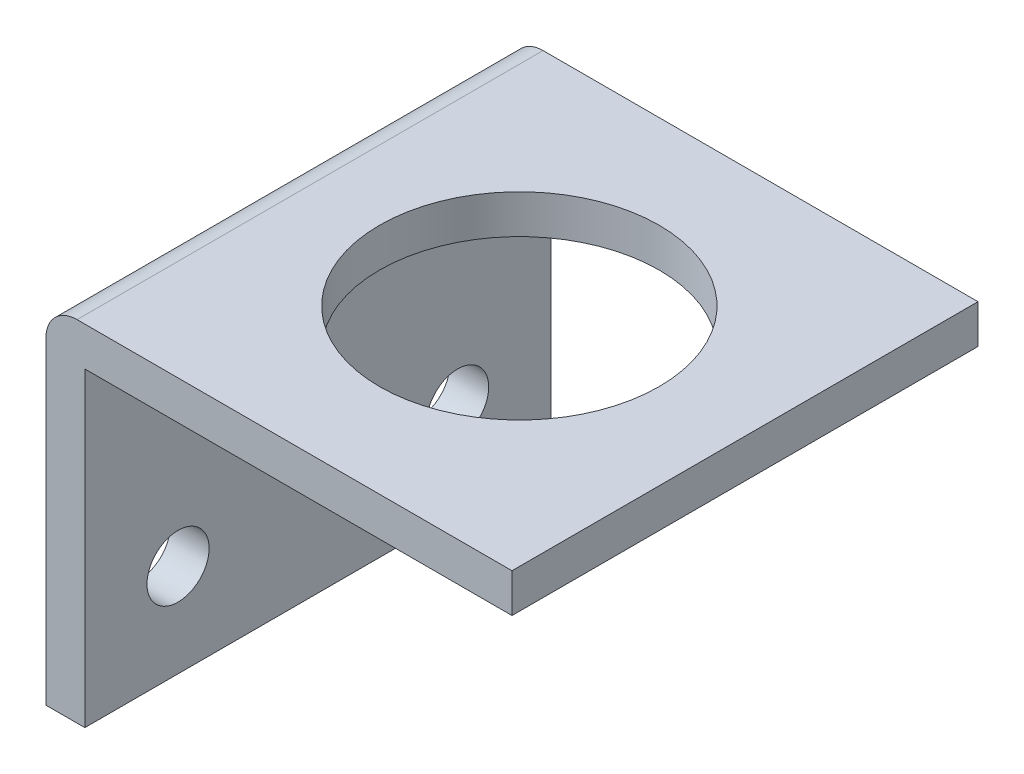
ISO-10303-21;
HEADER;
FILE_DESCRIPTION(('STEP AP214'),'2;1');
FILE_NAME('part.step','',(''),(''),'','','');
FILE_SCHEMA(('AUTOMOTIVE_DESIGN { 1 0 10303 214 1 1 1 1 }'));
ENDSEC;
DATA;
#1=APPLICATION_CONTEXT('core data for automotive mechanical design processes');
#2=APPLICATION_PROTOCOL_DEFINITION('international standard','automotive_design',2000,#1);
#3=PRODUCT_CONTEXT('',#1,'mechanical');
#4=PRODUCT('Part','Part','',(#3));
#5=PRODUCT_RELATED_PRODUCT_CATEGORY('part','',(#4));
#6=PRODUCT_DEFINITION_FORMATION('','',#4);
#7=PRODUCT_DEFINITION_CONTEXT('part definition',#1,'design');
#8=PRODUCT_DEFINITION('design','',#6,#7);
#9=PRODUCT_DEFINITION_SHAPE('','',#8);
#10=(LENGTH_UNIT() NAMED_UNIT(*) SI_UNIT(.MILLI.,.METRE.));
#11=(NAMED_UNIT(*) PLANE_ANGLE_UNIT() SI_UNIT($,.RADIAN.));
#12=(NAMED_UNIT(*) SI_UNIT($,.STERADIAN.) SOLID_ANGLE_UNIT());
#13=UNCERTAINTY_MEASURE_WITH_UNIT(LENGTH_MEASURE(1.E-05),#10,'distance_accuracy_value','');
#14=(GEOMETRIC_REPRESENTATION_CONTEXT(3) GLOBAL_UNCERTAINTY_ASSIGNED_CONTEXT((#13)) GLOBAL_UNIT_ASSIGNED_CONTEXT((#10,
#11,#12)) REPRESENTATION_CONTEXT('',''));
#15=CARTESIAN_POINT('',(0.,0.,0.));
#16=DIRECTION('',(0.,0.,1.));
#17=DIRECTION('',(1.,0.,0.));
#18=AXIS2_PLACEMENT_3D('',#15,#16,#17);
#19=CARTESIAN_POINT('',(0.,25.4,38.1));
#20=DIRECTION('',(0.,1.,0.));
#21=DIRECTION('',(0.,0.,1.));
#22=AXIS2_PLACEMENT_3D('',#19,#20,#21);
#23=PLANE('',#22);
#24=CARTESIAN_POINT('',(19.6498845337629,25.4,19.05));
#25=DIRECTION('',(0.,1.,0.));
#26=DIRECTION('',(0.,0.,1.));
#27=AXIS2_PLACEMENT_3D('',#24,#25,#26);
#28=CIRCLE('',#27,11.43);
#29=CARTESIAN_POINT('',(19.6498845337629,25.4,30.48));
#30=VERTEX_POINT('',#29);
#31=EDGE_CURVE('E164',#30,#30,#28,.T.);
#32=ORIENTED_EDGE('',*,*,#31,.T.);
#33=EDGE_LOOP('',(#32));
#34=FACE_BOUND('',#33,.T.);
#35=DIRECTION('',(1.,0.,0.));
#36=VECTOR('',#35,1.);
#37=CARTESIAN_POINT('',(0.,25.4,0.));
#38=LINE('',#37,#36);
#39=CARTESIAN_POINT('',(3.17499999999999,25.4,0.));
#40=VERTEX_POINT('',#39);
#41=CARTESIAN_POINT('',(38.1,25.4,0.));
#42=VERTEX_POINT('',#41);
#43=EDGE_CURVE('E127',#40,#42,#38,.T.);
#44=ORIENTED_EDGE('',*,*,#43,.T.);
#45=DIRECTION('',(0.,0.,-1.));
#46=VECTOR('',#45,1.);
#47=CARTESIAN_POINT('',(38.1,25.4,38.1));
#48=LINE('',#47,#46);
#49=CARTESIAN_POINT('',(38.1,25.4,38.1));
#50=VERTEX_POINT('',#49);
#51=EDGE_CURVE('E107',#50,#42,#48,.T.);
#52=ORIENTED_EDGE('',*,*,#51,.F.);
#53=DIRECTION('',(1.,0.,0.));
#54=VECTOR('',#53,1.);
#55=CARTESIAN_POINT('',(0.,25.4,38.1));
#56=LINE('',#55,#54);
#57=CARTESIAN_POINT('',(3.17499999999999,25.4,38.1));
#58=VERTEX_POINT('',#57);
#59=EDGE_CURVE('E114',#58,#50,#56,.T.);
#60=ORIENTED_EDGE('',*,*,#59,.F.);
#61=DIRECTION('',(0.,0.,-1.));
#62=VECTOR('',#61,1.);
#63=CARTESIAN_POINT('',(3.17499999999999,25.4,38.1));
#64=LINE('',#63,#62);
#65=EDGE_CURVE('E179',#58,#40,#64,.T.);
#66=ORIENTED_EDGE('',*,*,#65,.T.);
#67=EDGE_LOOP('',(#44,#52,#60,#66));
#68=FACE_BOUND('',#67,.T.);
#69=ADVANCED_FACE('F41',(#34,#68),#23,.F.);
#70=CARTESIAN_POINT('',(38.1,0.,38.1));
#71=DIRECTION('',(-1.,0.,0.));
#72=DIRECTION('',(0.,0.,1.));
#73=AXIS2_PLACEMENT_3D('',#70,#71,#72);
#74=PLANE('',#73);
#75=DIRECTION('',(0.,1.,0.));
#76=VECTOR('',#75,1.);
#77=CARTESIAN_POINT('',(38.1,0.,0.));
#78=LINE('',#77,#76);
#79=CARTESIAN_POINT('',(38.1,28.575,0.));
#80=VERTEX_POINT('',#79);
#81=EDGE_CURVE('E182',#42,#80,#78,.T.);
#82=ORIENTED_EDGE('',*,*,#81,.T.);
#83=DIRECTION('',(0.,0.,-1.));
#84=VECTOR('',#83,1.);
#85=CARTESIAN_POINT('',(38.1,28.575,38.1));
#86=LINE('',#85,#84);
#87=CARTESIAN_POINT('',(38.1,28.575,38.1));
#88=VERTEX_POINT('',#87);
#89=EDGE_CURVE('E110',#88,#80,#86,.T.);
#90=ORIENTED_EDGE('',*,*,#89,.F.);
#91=DIRECTION('',(0.,1.,0.));
#92=VECTOR('',#91,1.);
#93=CARTESIAN_POINT('',(38.1,0.,38.1));
#94=LINE('',#93,#92);
#95=EDGE_CURVE('E102',#50,#88,#94,.T.);
#96=ORIENTED_EDGE('',*,*,#95,.F.);
#97=ORIENTED_EDGE('',*,*,#51,.T.);
#98=EDGE_LOOP('',(#82,#90,#96,#97));
#99=FACE_BOUND('',#98,.T.);
#100=ADVANCED_FACE('F105',(#99),#74,.F.);
#101=CARTESIAN_POINT('',(0.,28.575,38.1));
#102=DIRECTION('',(0.,1.,0.));
#103=DIRECTION('',(0.,0.,1.));
#104=AXIS2_PLACEMENT_3D('',#101,#102,#103);
#105=PLANE('',#104);
#106=CARTESIAN_POINT('',(19.6498845337629,28.575,19.05));
#107=DIRECTION('',(0.,1.,0.));
#108=DIRECTION('',(0.,0.,1.));
#109=AXIS2_PLACEMENT_3D('',#106,#107,#108);
#110=CIRCLE('',#109,11.43);
#111=CARTESIAN_POINT('',(19.6498845337629,28.575,30.48));
#112=VERTEX_POINT('',#111);
#113=EDGE_CURVE('E151',#112,#112,#110,.T.);
#114=ORIENTED_EDGE('',*,*,#113,.F.);
#115=EDGE_LOOP('',(#114));
#116=FACE_BOUND('',#115,.T.);
#117=DIRECTION('',(1.,0.,0.));
#118=VECTOR('',#117,1.);
#119=CARTESIAN_POINT('',(0.,28.575,0.));
#120=LINE('',#119,#118);
#121=CARTESIAN_POINT('',(2.54,28.575,0.));
#122=VERTEX_POINT('',#121);
#123=EDGE_CURVE('E185',#122,#80,#120,.T.);
#124=ORIENTED_EDGE('',*,*,#123,.F.);
#125=DIRECTION('',(0.,0.,-1.));
#126=VECTOR('',#125,1.);
#127=CARTESIAN_POINT('',(2.54,28.575,38.1));
#128=LINE('',#127,#126);
#129=CARTESIAN_POINT('',(2.54,28.575,38.1));
#130=VERTEX_POINT('',#129);
#131=EDGE_CURVE('E51',#122,#130,#128,.F.);
#132=ORIENTED_EDGE('',*,*,#131,.T.);
#133=DIRECTION('',(1.,0.,0.));
#134=VECTOR('',#133,1.);
#135=CARTESIAN_POINT('',(0.,28.575,38.1));
#136=LINE('',#135,#134);
#137=EDGE_CURVE('E113',#130,#88,#136,.T.);
#138=ORIENTED_EDGE('',*,*,#137,.T.);
#139=ORIENTED_EDGE('',*,*,#89,.T.);
#140=EDGE_LOOP('',(#124,#132,#138,#139));
#141=FACE_BOUND('',#140,.T.);
#142=ADVANCED_FACE('F216',(#116,#141),#105,.T.);
#143=CARTESIAN_POINT('',(0.,0.,38.1));
#144=DIRECTION('',(-1.,0.,0.));
#145=DIRECTION('',(0.,0.,1.));
#146=AXIS2_PLACEMENT_3D('',#143,#144,#145);
#147=PLANE('',#146);
#148=CARTESIAN_POINT('',(0.,7.62,7.62));
#149=DIRECTION('',(-1.,0.,0.));
#150=DIRECTION('',(0.,0.,1.));
#151=AXIS2_PLACEMENT_3D('',#148,#149,#150);
#152=CIRCLE('',#151,2.54);
#153=CARTESIAN_POINT('',(0.,7.62,10.16));
#154=VERTEX_POINT('',#153);
#155=EDGE_CURVE('E145',#154,#154,#152,.T.);
#156=ORIENTED_EDGE('',*,*,#155,.F.);
#157=EDGE_LOOP('',(#156));
#158=FACE_BOUND('',#157,.T.);
#159=CARTESIAN_POINT('',(0.,7.62,30.48));
#160=DIRECTION('',(-1.,0.,0.));
#161=DIRECTION('',(0.,0.,1.));
#162=AXIS2_PLACEMENT_3D('',#159,#160,#161);
#163=CIRCLE('',#162,2.54000000000001);
#164=CARTESIAN_POINT('',(0.,7.62,33.02));
#165=VERTEX_POINT('',#164);
#166=EDGE_CURVE('E153',#165,#165,#163,.T.);
#167=ORIENTED_EDGE('',*,*,#166,.F.);
#168=EDGE_LOOP('',(#167));
#169=FACE_BOUND('',#168,.T.);
#170=DIRECTION('',(0.,1.,0.));
#171=VECTOR('',#170,1.);
#172=CARTESIAN_POINT('',(0.,0.,38.1));
#173=LINE('',#172,#171);
#174=CARTESIAN_POINT('',(0.,0.,38.1));
#175=VERTEX_POINT('',#174);
#176=CARTESIAN_POINT('',(0.,26.035,38.1));
#177=VERTEX_POINT('',#176);
#178=EDGE_CURVE('E170',#175,#177,#173,.T.);
#179=ORIENTED_EDGE('',*,*,#178,.T.);
#180=DIRECTION('',(0.,0.,-1.));
#181=VECTOR('',#180,1.);
#182=CARTESIAN_POINT('',(0.,26.035,38.1));
#183=LINE('',#182,#181);
#184=CARTESIAN_POINT('',(0.,26.035,0.));
#185=VERTEX_POINT('',#184);
#186=EDGE_CURVE('E129',#177,#185,#183,.T.);
#187=ORIENTED_EDGE('',*,*,#186,.T.);
#188=DIRECTION('',(0.,1.,0.));
#189=VECTOR('',#188,1.);
#190=CARTESIAN_POINT('',(0.,0.,0.));
#191=LINE('',#190,#189);
#192=CARTESIAN_POINT('',(0.,0.,0.));
#193=VERTEX_POINT('',#192);
#194=EDGE_CURVE('E188',#193,#185,#191,.T.);
#195=ORIENTED_EDGE('',*,*,#194,.F.);
#196=DIRECTION('',(0.,0.,-1.));
#197=VECTOR('',#196,1.);
#198=CARTESIAN_POINT('',(0.,0.,38.1));
#199=LINE('',#198,#197);
#200=EDGE_CURVE('E135',#175,#193,#199,.T.);
#201=ORIENTED_EDGE('',*,*,#200,.F.);
#202=EDGE_LOOP('',(#179,#187,#195,#201));
#203=FACE_BOUND('',#202,.T.);
#204=ADVANCED_FACE('F212',(#158,#169,#203),#147,.T.);
#205=CARTESIAN_POINT('',(0.,0.,38.1));
#206=DIRECTION('',(0.,1.,0.));
#207=DIRECTION('',(0.,0.,1.));
#208=AXIS2_PLACEMENT_3D('',#205,#206,#207);
#209=PLANE('',#208);
#210=DIRECTION('',(1.,0.,0.));
#211=VECTOR('',#210,1.);
#212=CARTESIAN_POINT('',(0.,0.,0.));
#213=LINE('',#212,#211);
#214=CARTESIAN_POINT('',(3.175,0.,0.));
#215=VERTEX_POINT('',#214);
#216=EDGE_CURVE('E191',#193,#215,#213,.T.);
#217=ORIENTED_EDGE('',*,*,#216,.T.);
#218=DIRECTION('',(0.,0.,-1.));
#219=VECTOR('',#218,1.);
#220=CARTESIAN_POINT('',(3.175,0.,38.1));
#221=LINE('',#220,#219);
#222=CARTESIAN_POINT('',(3.175,0.,38.1));
#223=VERTEX_POINT('',#222);
#224=EDGE_CURVE('E198',#223,#215,#221,.T.);
#225=ORIENTED_EDGE('',*,*,#224,.F.);
#226=DIRECTION('',(1.,0.,0.));
#227=VECTOR('',#226,1.);
#228=CARTESIAN_POINT('',(0.,0.,38.1));
#229=LINE('',#228,#227);
#230=EDGE_CURVE('E174',#175,#223,#229,.T.);
#231=ORIENTED_EDGE('',*,*,#230,.F.);
#232=ORIENTED_EDGE('',*,*,#200,.T.);
#233=EDGE_LOOP('',(#217,#225,#231,#232));
#234=FACE_BOUND('',#233,.T.);
#235=ADVANCED_FACE('F205',(#234),#209,.F.);
#236=CARTESIAN_POINT('',(3.175,0.,38.1));
#237=DIRECTION('',(-1.,0.,0.));
#238=DIRECTION('',(0.,-1.,0.));
#239=AXIS2_PLACEMENT_3D('',#236,#237,#238);
#240=PLANE('',#239);
#241=CARTESIAN_POINT('',(3.175,7.62,7.62));
#242=DIRECTION('',(-1.,0.,0.));
#243=DIRECTION('',(0.,-1.,0.));
#244=AXIS2_PLACEMENT_3D('',#241,#242,#243);
#245=CIRCLE('',#244,2.54);
#246=CARTESIAN_POINT('',(3.17500000000001,7.62,10.16));
#247=VERTEX_POINT('',#246);
#248=EDGE_CURVE('E45',#247,#247,#245,.T.);
#249=ORIENTED_EDGE('',*,*,#248,.T.);
#250=EDGE_LOOP('',(#249));
#251=FACE_BOUND('',#250,.T.);
#252=CARTESIAN_POINT('',(3.175,7.62,30.48));
#253=DIRECTION('',(-1.,0.,0.));
#254=DIRECTION('',(0.,-1.,0.));
#255=AXIS2_PLACEMENT_3D('',#252,#253,#254);
#256=CIRCLE('',#255,2.54000000000001);
#257=CARTESIAN_POINT('',(3.17500000000001,7.62,33.02));
#258=VERTEX_POINT('',#257);
#259=EDGE_CURVE('E142',#258,#258,#256,.T.);
#260=ORIENTED_EDGE('',*,*,#259,.T.);
#261=EDGE_LOOP('',(#260));
#262=FACE_BOUND('',#261,.T.);
#263=DIRECTION('',(0.,1.,0.));
#264=VECTOR('',#263,1.);
#265=CARTESIAN_POINT('',(3.175,0.,0.));
#266=LINE('',#265,#264);
#267=EDGE_CURVE('E124',#215,#40,#266,.T.);
#268=ORIENTED_EDGE('',*,*,#267,.T.);
#269=ORIENTED_EDGE('',*,*,#65,.F.);
#270=DIRECTION('',(0.,1.,0.));
#271=VECTOR('',#270,1.);
#272=CARTESIAN_POINT('',(3.175,0.,38.1));
#273=LINE('',#272,#271);
#274=EDGE_CURVE('E119',#223,#58,#273,.T.);
#275=ORIENTED_EDGE('',*,*,#274,.F.);
#276=ORIENTED_EDGE('',*,*,#224,.T.);
#277=EDGE_LOOP('',(#268,#269,#275,#276));
#278=FACE_BOUND('',#277,.T.);
#279=ADVANCED_FACE('F250',(#251,#262,#278),#240,.F.);
#280=CARTESIAN_POINT('',(0.,0.,38.1));
#281=DIRECTION('',(0.,0.,1.));
#282=DIRECTION('',(1.,0.,0.));
#283=AXIS2_PLACEMENT_3D('',#280,#281,#282);
#284=PLANE('',#283);
#285=ORIENTED_EDGE('',*,*,#137,.F.);
#286=CARTESIAN_POINT('',(2.54,26.035,38.1));
#287=DIRECTION('',(0.,0.,1.));
#288=DIRECTION('',(1.,0.,0.));
#289=AXIS2_PLACEMENT_3D('',#286,#287,#288);
#290=CIRCLE('',#289,2.54);
#291=EDGE_CURVE('E11',#130,#177,#290,.T.);
#292=ORIENTED_EDGE('',*,*,#291,.T.);
#293=ORIENTED_EDGE('',*,*,#178,.F.);
#294=ORIENTED_EDGE('',*,*,#230,.T.);
#295=ORIENTED_EDGE('',*,*,#274,.T.);
#296=ORIENTED_EDGE('',*,*,#59,.T.);
#297=ORIENTED_EDGE('',*,*,#95,.T.);
#298=EDGE_LOOP('',(#285,#292,#293,#294,#295,#296,#297));
#299=FACE_BOUND('',#298,.T.);
#300=ADVANCED_FACE('F117',(#299),#284,.T.);
#301=CARTESIAN_POINT('',(0.,0.,0.));
#302=DIRECTION('',(0.,0.,1.));
#303=DIRECTION('',(1.,0.,0.));
#304=AXIS2_PLACEMENT_3D('',#301,#302,#303);
#305=PLANE('',#304);
#306=ORIENTED_EDGE('',*,*,#194,.T.);
#307=CARTESIAN_POINT('',(2.54,26.035,0.));
#308=DIRECTION('',(0.,0.,1.));
#309=DIRECTION('',(1.,0.,0.));
#310=AXIS2_PLACEMENT_3D('',#307,#308,#309);
#311=CIRCLE('',#310,2.54);
#312=EDGE_CURVE('E66',#185,#122,#311,.F.);
#313=ORIENTED_EDGE('',*,*,#312,.T.);
#314=ORIENTED_EDGE('',*,*,#123,.T.);
#315=ORIENTED_EDGE('',*,*,#81,.F.);
#316=ORIENTED_EDGE('',*,*,#43,.F.);
#317=ORIENTED_EDGE('',*,*,#267,.F.);
#318=ORIENTED_EDGE('',*,*,#216,.F.);
#319=EDGE_LOOP('',(#306,#313,#314,#315,#316,#317,#318));
#320=FACE_BOUND('',#319,.T.);
#321=ADVANCED_FACE('F211',(#320),#305,.F.);
#322=CARTESIAN_POINT('',(2.54,26.035,38.1));
#323=DIRECTION('',(0.,0.,-1.));
#324=DIRECTION('',(-1.,0.,0.));
#325=AXIS2_PLACEMENT_3D('',#322,#323,#324);
#326=CYLINDRICAL_SURFACE('',#325,2.54);
#327=ORIENTED_EDGE('',*,*,#291,.F.);
#328=ORIENTED_EDGE('',*,*,#131,.F.);
#329=ORIENTED_EDGE('',*,*,#312,.F.);
#330=ORIENTED_EDGE('',*,*,#186,.F.);
#331=EDGE_LOOP('',(#327,#328,#329,#330));
#332=FACE_BOUND('',#331,.T.);
#333=ADVANCED_FACE('F43',(#332),#326,.T.);
#334=CARTESIAN_POINT('',(19.6498845337629,-9.525,19.05));
#335=DIRECTION('',(0.,1.,0.));
#336=DIRECTION('',(0.,0.,1.));
#337=AXIS2_PLACEMENT_3D('',#334,#335,#336);
#338=CYLINDRICAL_SURFACE('',#337,11.43);
#339=CARTESIAN_POINT('',(19.6498845337629,28.575,30.48));
#340=CARTESIAN_POINT('',(19.6498845337629,28.5419270833333,30.48));
#341=CARTESIAN_POINT('',(19.6498845337629,28.5088541666667,30.48));
#342=CARTESIAN_POINT('',(19.6498845337629,28.4427083333333,30.48));
#343=CARTESIAN_POINT('',(19.6498845337629,28.4096354166667,30.48));
#344=CARTESIAN_POINT('',(19.6498845337629,28.3434895833333,30.48));
#345=CARTESIAN_POINT('',(19.6498845337629,28.3104166666667,30.48));
#346=CARTESIAN_POINT('',(19.6498845337629,28.2442708333333,30.48));
#347=CARTESIAN_POINT('',(19.6498845337629,28.2111979166667,30.48));
#348=CARTESIAN_POINT('',(19.6498845337629,28.1450520833333,30.48));
#349=CARTESIAN_POINT('',(19.6498845337629,28.1119791666667,30.48));
#350=CARTESIAN_POINT('',(19.6498845337629,28.0458333333333,30.48));
#351=CARTESIAN_POINT('',(19.6498845337629,28.0127604166667,30.48));
#352=CARTESIAN_POINT('',(19.6498845337629,27.9466145833333,30.48));
#353=CARTESIAN_POINT('',(19.6498845337629,27.9135416666667,30.48));
#354=CARTESIAN_POINT('',(19.6498845337629,27.8473958333333,30.48));
#355=CARTESIAN_POINT('',(19.6498845337629,27.8143229166667,30.48));
#356=CARTESIAN_POINT('',(19.6498845337629,27.7481770833333,30.48));
#357=CARTESIAN_POINT('',(19.6498845337629,27.7151041666667,30.48));
#358=CARTESIAN_POINT('',(19.6498845337629,27.6489583333333,30.48));
#359=CARTESIAN_POINT('',(19.6498845337629,27.6158854166667,30.48));
#360=CARTESIAN_POINT('',(19.6498845337629,27.5497395833333,30.48));
#361=CARTESIAN_POINT('',(19.6498845337629,27.5166666666667,30.48));
#362=CARTESIAN_POINT('',(19.6498845337629,27.4505208333333,30.48));
#363=CARTESIAN_POINT('',(19.6498845337629,27.4174479166667,30.48));
#364=CARTESIAN_POINT('',(19.6498845337629,27.3513020833333,30.48));
#365=CARTESIAN_POINT('',(19.6498845337629,27.3182291666667,30.48));
#366=CARTESIAN_POINT('',(19.6498845337629,27.2520833333333,30.48));
#367=CARTESIAN_POINT('',(19.6498845337629,27.2190104166667,30.48));
#368=CARTESIAN_POINT('',(19.6498845337629,27.1528645833333,30.48));
#369=CARTESIAN_POINT('',(19.6498845337629,27.1197916666667,30.48));
#370=CARTESIAN_POINT('',(19.6498845337629,27.0536458333333,30.48));
#371=CARTESIAN_POINT('',(19.6498845337629,27.0205729166667,30.48));
#372=CARTESIAN_POINT('',(19.6498845337629,26.9544270833333,30.48));
#373=CARTESIAN_POINT('',(19.6498845337629,26.9213541666667,30.48));
#374=CARTESIAN_POINT('',(19.6498845337629,26.8552083333333,30.48));
#375=CARTESIAN_POINT('',(19.6498845337629,26.8221354166667,30.48));
#376=CARTESIAN_POINT('',(19.6498845337629,26.7559895833333,30.48));
#377=CARTESIAN_POINT('',(19.6498845337629,26.7229166666667,30.48));
#378=CARTESIAN_POINT('',(19.6498845337629,26.6567708333333,30.48));
#379=CARTESIAN_POINT('',(19.6498845337629,26.6236979166667,30.48));
#380=CARTESIAN_POINT('',(19.6498845337629,26.5575520833333,30.48));
#381=CARTESIAN_POINT('',(19.6498845337629,26.5244791666667,30.48));
#382=CARTESIAN_POINT('',(19.6498845337629,26.4583333333333,30.48));
#383=CARTESIAN_POINT('',(19.6498845337629,26.4252604166667,30.48));
#384=CARTESIAN_POINT('',(19.6498845337629,26.3591145833333,30.48));
#385=CARTESIAN_POINT('',(19.6498845337629,26.3260416666667,30.48));
#386=CARTESIAN_POINT('',(19.6498845337629,26.2598958333333,30.48));
#387=CARTESIAN_POINT('',(19.6498845337629,26.2268229166667,30.48));
#388=CARTESIAN_POINT('',(19.6498845337629,26.1606770833333,30.48));
#389=CARTESIAN_POINT('',(19.6498845337629,26.1276041666667,30.48));
#390=CARTESIAN_POINT('',(19.6498845337629,26.0614583333333,30.48));
#391=CARTESIAN_POINT('',(19.6498845337629,26.0283854166667,30.48));
#392=CARTESIAN_POINT('',(19.6498845337629,25.9622395833333,30.48));
#393=CARTESIAN_POINT('',(19.6498845337629,25.9291666666667,30.48));
#394=CARTESIAN_POINT('',(19.6498845337629,25.8630208333333,30.48));
#395=CARTESIAN_POINT('',(19.6498845337629,25.8299479166667,30.48));
#396=CARTESIAN_POINT('',(19.6498845337629,25.7638020833333,30.48));
#397=CARTESIAN_POINT('',(19.6498845337629,25.7307291666667,30.48));
#398=CARTESIAN_POINT('',(19.6498845337629,25.6645833333333,30.48));
#399=CARTESIAN_POINT('',(19.6498845337629,25.6315104166667,30.48));
#400=CARTESIAN_POINT('',(19.6498845337629,25.5653645833333,30.48));
#401=CARTESIAN_POINT('',(19.6498845337629,25.5322916666667,30.48));
#402=CARTESIAN_POINT('',(19.6498845337629,25.4661458333333,30.48));
#403=CARTESIAN_POINT('',(19.6498845337629,25.4330729166667,30.48));
#404=CARTESIAN_POINT('',(19.6498845337629,25.4,30.48));
#405=B_SPLINE_CURVE_WITH_KNOTS('',3,(#339,#340,#341,#342,#343,#344,#345,#346,#347,#348,#349,
#350,#351,#352,#353,#354,#355,#356,#357,#358,#359,#360,#361,#362,#363,#364,#365,#366,#367,#368,
#369,#370,#371,#372,#373,#374,#375,#376,#377,#378,#379,#380,#381,#382,#383,#384,#385,#386,#387,
#388,#389,#390,#391,#392,#393,#394,#395,#396,#397,#398,#399,#400,#401,#402,#403,#404),
.UNSPECIFIED.,.F.,.F.,(4,2,2,2,2,2,2,2,2,2,2,2,2,2,2,2,2,2,2,2,2,2,2,2,2,2,2,2,2,2,2,2,4),(0.,
0.0992187499999977,0.198437500000002,0.29765625,0.396875000000005,0.496093750000003,0.5953125,
0.694531250000005,0.793750000000003,0.892968750000001,0.992187500000005,1.09140625,1.190625,
1.28984375000001,1.3890625,1.48828125000001,1.58750000000001,1.68671875,1.78593750000001,
1.88515625000001,1.98437500000001,2.08359375000001,2.18281250000001,2.28203125000001,
2.38125000000001,2.48046875000001,2.57968750000001,2.67890625000001,2.77812500000001,
2.87734375000001,2.97656250000001,3.07578125000001,3.17500000000001),.UNSPECIFIED.);
#406=EDGE_CURVE('BSEAM234',#112,#30,#405,.T.);
#407=ORIENTED_EDGE('',*,*,#113,.T.);
#408=ORIENTED_EDGE('',*,*,#31,.F.);
#409=ORIENTED_EDGE('',*,*,#406,.T.);
#410=ORIENTED_EDGE('',*,*,#406,.F.);
#411=EDGE_LOOP('',(#407,#409,#408,#410));
#412=FACE_BOUND('',#411,.T.);
#413=ADVANCED_FACE('F234',(#412),#338,.F.);
#414=CARTESIAN_POINT('',(38.1,7.62,30.48));
#415=DIRECTION('',(-1.,0.,0.));
#416=DIRECTION('',(0.,0.,1.));
#417=AXIS2_PLACEMENT_3D('',#414,#415,#416);
#418=CYLINDRICAL_SURFACE('',#417,2.54000000000001);
#419=CARTESIAN_POINT('',(0.,7.62,33.02));
#420=CARTESIAN_POINT('',(0.0330729166666659,7.62,33.02));
#421=CARTESIAN_POINT('',(0.0661458333333318,7.62,33.02));
#422=CARTESIAN_POINT('',(0.132291666666666,7.62,33.02));
#423=CARTESIAN_POINT('',(0.165364583333334,7.62,33.02));
#424=CARTESIAN_POINT('',(0.231510416666668,7.62,33.02));
#425=CARTESIAN_POINT('',(0.264583333333334,7.62,33.02));
#426=CARTESIAN_POINT('',(0.330729166666668,7.62,33.02));
#427=CARTESIAN_POINT('',(0.363802083333337,7.62,33.02));
#428=CARTESIAN_POINT('',(0.429947916666671,7.62,33.02));
#429=CARTESIAN_POINT('',(0.463020833333337,7.62,33.02));
#430=CARTESIAN_POINT('',(0.529166666666669,7.62,33.02));
#431=CARTESIAN_POINT('',(0.562239583333334,7.62,33.02));
#432=CARTESIAN_POINT('',(0.628385416666669,7.62,33.02));
#433=CARTESIAN_POINT('',(0.661458333333337,7.62,33.02));
#434=CARTESIAN_POINT('',(0.727604166666671,7.62,33.02));
#435=CARTESIAN_POINT('',(0.760677083333337,7.62,33.02));
#436=CARTESIAN_POINT('',(0.826822916666669,7.62,33.02));
#437=CARTESIAN_POINT('',(0.859895833333335,7.62,33.02));
#438=CARTESIAN_POINT('',(0.926041666666669,7.62,33.02));
#439=CARTESIAN_POINT('',(0.959114583333337,7.62,33.02));
#440=CARTESIAN_POINT('',(1.02526041666667,7.62,33.02));
#441=CARTESIAN_POINT('',(1.05833333333334,7.62,33.02));
#442=CARTESIAN_POINT('',(1.12447916666667,7.62,33.02));
#443=CARTESIAN_POINT('',(1.15755208333333,7.62,33.02));
#444=CARTESIAN_POINT('',(1.22369791666667,7.62,33.02));
#445=CARTESIAN_POINT('',(1.25677083333334,7.62,33.02));
#446=CARTESIAN_POINT('',(1.32291666666667,7.62,33.02));
#447=CARTESIAN_POINT('',(1.35598958333334,7.62,33.02));
#448=CARTESIAN_POINT('',(1.42213541666667,7.62,33.02));
#449=CARTESIAN_POINT('',(1.45520833333334,7.62,33.02));
#450=CARTESIAN_POINT('',(1.52135416666667,7.62,33.02));
#451=CARTESIAN_POINT('',(1.55442708333334,7.62,33.02));
#452=CARTESIAN_POINT('',(1.62057291666667,7.62,33.02));
#453=CARTESIAN_POINT('',(1.65364583333334,7.62,33.02));
#454=CARTESIAN_POINT('',(1.71979166666667,7.62,33.02));
#455=CARTESIAN_POINT('',(1.75286458333334,7.62,33.02));
#456=CARTESIAN_POINT('',(1.81901041666667,7.62,33.02));
#457=CARTESIAN_POINT('',(1.85208333333334,7.62,33.02));
#458=CARTESIAN_POINT('',(1.91822916666667,7.62,33.02));
#459=CARTESIAN_POINT('',(1.95130208333334,7.62,33.02));
#460=CARTESIAN_POINT('',(2.01744791666668,7.62,33.02));
#461=CARTESIAN_POINT('',(2.05052083333334,7.62,33.02));
#462=CARTESIAN_POINT('',(2.11666666666667,7.62,33.02));
#463=CARTESIAN_POINT('',(2.14973958333334,7.62,33.02));
#464=CARTESIAN_POINT('',(2.21588541666667,7.62,33.02));
#465=CARTESIAN_POINT('',(2.24895833333334,7.62,33.02));
#466=CARTESIAN_POINT('',(2.31510416666668,7.62,33.02));
#467=CARTESIAN_POINT('',(2.34817708333334,7.62,33.02));
#468=CARTESIAN_POINT('',(2.41432291666667,7.62,33.02));
#469=CARTESIAN_POINT('',(2.44739583333334,7.62,33.02));
#470=CARTESIAN_POINT('',(2.51354166666667,7.62,33.02));
#471=CARTESIAN_POINT('',(2.54661458333334,7.62,33.02));
#472=CARTESIAN_POINT('',(2.61276041666668,7.62,33.02));
#473=CARTESIAN_POINT('',(2.64583333333334,7.62,33.02));
#474=CARTESIAN_POINT('',(2.71197916666667,7.62,33.02));
#475=CARTESIAN_POINT('',(2.74505208333334,7.62,33.02));
#476=CARTESIAN_POINT('',(2.81119791666667,7.62,33.02));
#477=CARTESIAN_POINT('',(2.84427083333334,7.62,33.02));
#478=CARTESIAN_POINT('',(2.91041666666668,7.62,33.02));
#479=CARTESIAN_POINT('',(2.94348958333334,7.62,33.02));
#480=CARTESIAN_POINT('',(3.00963541666668,7.62,33.02));
#481=CARTESIAN_POINT('',(3.04270833333335,7.62,33.02));
#482=CARTESIAN_POINT('',(3.10885416666668,7.62,33.02));
#483=CARTESIAN_POINT('',(3.14192708333335,7.62,33.02));
#484=CARTESIAN_POINT('',(3.17500000000001,7.62,33.02));
#485=B_SPLINE_CURVE_WITH_KNOTS('',3,(#419,#420,#421,#422,#423,#424,#425,#426,#427,#428,#429,
#430,#431,#432,#433,#434,#435,#436,#437,#438,#439,#440,#441,#442,#443,#444,#445,#446,#447,#448,
#449,#450,#451,#452,#453,#454,#455,#456,#457,#458,#459,#460,#461,#462,#463,#464,#465,#466,#467,
#468,#469,#470,#471,#472,#473,#474,#475,#476,#477,#478,#479,#480,#481,#482,#483,#484),
.UNSPECIFIED.,.F.,.F.,(4,2,2,2,2,2,2,2,2,2,2,2,2,2,2,2,2,2,2,2,2,2,2,2,2,2,2,2,2,2,2,2,4),(0.,
0.0992187499999977,0.198437500000002,0.29765625,0.396875000000005,0.496093750000003,0.5953125,
0.694531250000005,0.793750000000003,0.892968750000001,0.992187500000005,1.09140625,1.190625,
1.28984375000001,1.3890625,1.48828125000001,1.58750000000001,1.68671875,1.78593750000001,
1.88515625000001,1.98437500000001,2.08359375000001,2.18281250000001,2.28203125000001,
2.38125000000001,2.48046875000001,2.57968750000001,2.67890625000001,2.77812500000001,
2.87734375000001,2.97656250000001,3.07578125000001,3.17500000000001),.UNSPECIFIED.);
#486=EDGE_CURVE('BSEAM236',#165,#258,#485,.T.);
#487=ORIENTED_EDGE('',*,*,#166,.T.);
#488=ORIENTED_EDGE('',*,*,#259,.F.);
#489=ORIENTED_EDGE('',*,*,#486,.T.);
#490=ORIENTED_EDGE('',*,*,#486,.F.);
#491=EDGE_LOOP('',(#487,#489,#488,#490));
#492=FACE_BOUND('',#491,.T.);
#493=ADVANCED_FACE('F236',(#492),#418,.F.);
#494=CARTESIAN_POINT('',(38.1,7.62,7.62));
#495=DIRECTION('',(-1.,0.,0.));
#496=DIRECTION('',(0.,0.,1.));
#497=AXIS2_PLACEMENT_3D('',#494,#495,#496);
#498=CYLINDRICAL_SURFACE('',#497,2.54);
#499=CARTESIAN_POINT('',(0.,7.62,10.16));
#500=CARTESIAN_POINT('',(0.0330729166666659,7.62,10.16));
#501=CARTESIAN_POINT('',(0.0661458333333318,7.62,10.16));
#502=CARTESIAN_POINT('',(0.132291666666666,7.62,10.16));
#503=CARTESIAN_POINT('',(0.165364583333334,7.62,10.16));
#504=CARTESIAN_POINT('',(0.231510416666668,7.62,10.16));
#505=CARTESIAN_POINT('',(0.264583333333334,7.62,10.16));
#506=CARTESIAN_POINT('',(0.330729166666668,7.62,10.16));
#507=CARTESIAN_POINT('',(0.363802083333337,7.62,10.16));
#508=CARTESIAN_POINT('',(0.429947916666671,7.62,10.16));
#509=CARTESIAN_POINT('',(0.463020833333337,7.62,10.16));
#510=CARTESIAN_POINT('',(0.529166666666669,7.62,10.16));
#511=CARTESIAN_POINT('',(0.562239583333334,7.62,10.16));
#512=CARTESIAN_POINT('',(0.628385416666669,7.62,10.16));
#513=CARTESIAN_POINT('',(0.661458333333337,7.62,10.16));
#514=CARTESIAN_POINT('',(0.727604166666671,7.62,10.16));
#515=CARTESIAN_POINT('',(0.760677083333337,7.62,10.16));
#516=CARTESIAN_POINT('',(0.826822916666669,7.62,10.16));
#517=CARTESIAN_POINT('',(0.859895833333335,7.62,10.16));
#518=CARTESIAN_POINT('',(0.926041666666669,7.62,10.16));
#519=CARTESIAN_POINT('',(0.959114583333337,7.62,10.16));
#520=CARTESIAN_POINT('',(1.02526041666667,7.62,10.16));
#521=CARTESIAN_POINT('',(1.05833333333334,7.62,10.16));
#522=CARTESIAN_POINT('',(1.12447916666667,7.62,10.16));
#523=CARTESIAN_POINT('',(1.15755208333333,7.62,10.16));
#524=CARTESIAN_POINT('',(1.22369791666667,7.62,10.16));
#525=CARTESIAN_POINT('',(1.25677083333334,7.62,10.16));
#526=CARTESIAN_POINT('',(1.32291666666667,7.62,10.16));
#527=CARTESIAN_POINT('',(1.35598958333334,7.62,10.16));
#528=CARTESIAN_POINT('',(1.42213541666667,7.62,10.16));
#529=CARTESIAN_POINT('',(1.45520833333334,7.62,10.16));
#530=CARTESIAN_POINT('',(1.52135416666667,7.62,10.16));
#531=CARTESIAN_POINT('',(1.55442708333334,7.62,10.16));
#532=CARTESIAN_POINT('',(1.62057291666667,7.62,10.16));
#533=CARTESIAN_POINT('',(1.65364583333334,7.62,10.16));
#534=CARTESIAN_POINT('',(1.71979166666667,7.62,10.16));
#535=CARTESIAN_POINT('',(1.75286458333334,7.62,10.16));
#536=CARTESIAN_POINT('',(1.81901041666667,7.62,10.16));
#537=CARTESIAN_POINT('',(1.85208333333334,7.62,10.16));
#538=CARTESIAN_POINT('',(1.91822916666667,7.62,10.16));
#539=CARTESIAN_POINT('',(1.95130208333334,7.62,10.16));
#540=CARTESIAN_POINT('',(2.01744791666668,7.62,10.16));
#541=CARTESIAN_POINT('',(2.05052083333334,7.62,10.16));
#542=CARTESIAN_POINT('',(2.11666666666667,7.62,10.16));
#543=CARTESIAN_POINT('',(2.14973958333334,7.62,10.16));
#544=CARTESIAN_POINT('',(2.21588541666667,7.62,10.16));
#545=CARTESIAN_POINT('',(2.24895833333334,7.62,10.16));
#546=CARTESIAN_POINT('',(2.31510416666668,7.62,10.16));
#547=CARTESIAN_POINT('',(2.34817708333334,7.62,10.16));
#548=CARTESIAN_POINT('',(2.41432291666667,7.62,10.16));
#549=CARTESIAN_POINT('',(2.44739583333334,7.62,10.16));
#550=CARTESIAN_POINT('',(2.51354166666667,7.62,10.16));
#551=CARTESIAN_POINT('',(2.54661458333334,7.62,10.16));
#552=CARTESIAN_POINT('',(2.61276041666668,7.62,10.16));
#553=CARTESIAN_POINT('',(2.64583333333334,7.62,10.16));
#554=CARTESIAN_POINT('',(2.71197916666667,7.62,10.16));
#555=CARTESIAN_POINT('',(2.74505208333334,7.62,10.16));
#556=CARTESIAN_POINT('',(2.81119791666667,7.62,10.16));
#557=CARTESIAN_POINT('',(2.84427083333334,7.62,10.16));
#558=CARTESIAN_POINT('',(2.91041666666668,7.62,10.16));
#559=CARTESIAN_POINT('',(2.94348958333334,7.62,10.16));
#560=CARTESIAN_POINT('',(3.00963541666668,7.62,10.16));
#561=CARTESIAN_POINT('',(3.04270833333335,7.62,10.16));
#562=CARTESIAN_POINT('',(3.10885416666668,7.62,10.16));
#563=CARTESIAN_POINT('',(3.14192708333335,7.62,10.16));
#564=CARTESIAN_POINT('',(3.17500000000001,7.62,10.16));
#565=B_SPLINE_CURVE_WITH_KNOTS('',3,(#499,#500,#501,#502,#503,#504,#505,#506,#507,#508,#509,
#510,#511,#512,#513,#514,#515,#516,#517,#518,#519,#520,#521,#522,#523,#524,#525,#526,#527,#528,
#529,#530,#531,#532,#533,#534,#535,#536,#537,#538,#539,#540,#541,#542,#543,#544,#545,#546,#547,
#548,#549,#550,#551,#552,#553,#554,#555,#556,#557,#558,#559,#560,#561,#562,#563,#564),
.UNSPECIFIED.,.F.,.F.,(4,2,2,2,2,2,2,2,2,2,2,2,2,2,2,2,2,2,2,2,2,2,2,2,2,2,2,2,2,2,2,2,4),(0.,
0.0992187499999977,0.198437500000002,0.29765625,0.396875000000005,0.496093750000003,0.5953125,
0.694531250000005,0.793750000000003,0.892968750000001,0.992187500000005,1.09140625,1.190625,
1.28984375000001,1.3890625,1.48828125000001,1.58750000000001,1.68671875,1.78593750000001,
1.88515625000001,1.98437500000001,2.08359375000001,2.18281250000001,2.28203125000001,
2.38125000000001,2.48046875000001,2.57968750000001,2.67890625000001,2.77812500000001,
2.87734375000001,2.97656250000001,3.07578125000001,3.17500000000001),.UNSPECIFIED.);
#566=EDGE_CURVE('BSEAM243',#154,#247,#565,.T.);
#567=ORIENTED_EDGE('',*,*,#155,.T.);
#568=ORIENTED_EDGE('',*,*,#248,.F.);
#569=ORIENTED_EDGE('',*,*,#566,.T.);
#570=ORIENTED_EDGE('',*,*,#566,.F.);
#571=EDGE_LOOP('',(#567,#569,#568,#570));
#572=FACE_BOUND('',#571,.T.);
#573=ADVANCED_FACE('F243',(#572),#498,.F.);
#574=CLOSED_SHELL('',(#69,#100,#142,#204,#235,#279,#300,#321,#333,#413,#493,#573));
#575=MANIFOLD_SOLID_BREP('B2',#574);
#576=ADVANCED_BREP_SHAPE_REPRESENTATION('',(#18,#575),#14);
#577=SHAPE_DEFINITION_REPRESENTATION(#9,#576);
ENDSEC;
END-ISO-10303-21;
